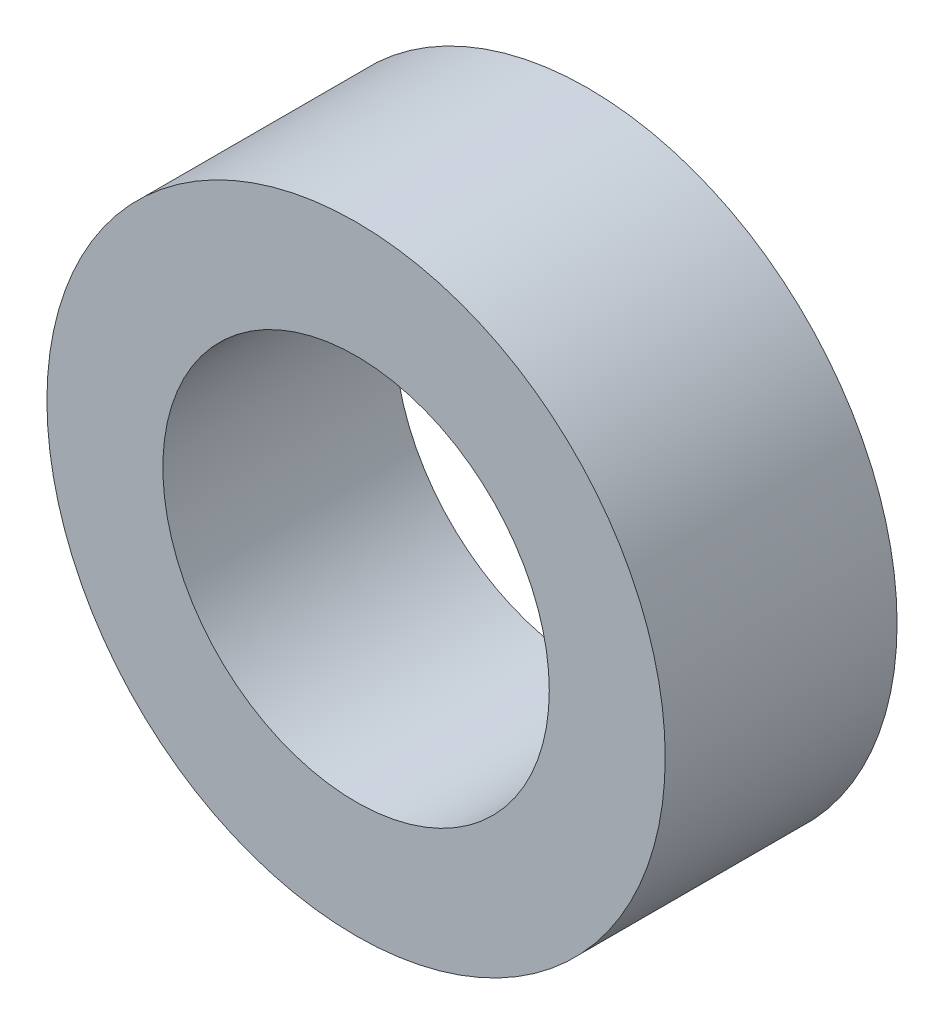
ISO-10303-21;
HEADER;
FILE_DESCRIPTION(('STEP AP214'),'2;1');
FILE_NAME('part.step','',(''),(''),'','','');
FILE_SCHEMA(('AUTOMOTIVE_DESIGN { 1 0 10303 214 1 1 1 1 }'));
ENDSEC;
DATA;
#1=APPLICATION_CONTEXT('core data for automotive mechanical design processes');
#2=APPLICATION_PROTOCOL_DEFINITION('international standard','automotive_design',2000,#1);
#3=PRODUCT_CONTEXT('',#1,'mechanical');
#4=PRODUCT('Part','Part','',(#3));
#5=PRODUCT_RELATED_PRODUCT_CATEGORY('part','',(#4));
#6=PRODUCT_DEFINITION_FORMATION('','',#4);
#7=PRODUCT_DEFINITION_CONTEXT('part definition',#1,'design');
#8=PRODUCT_DEFINITION('design','',#6,#7);
#9=PRODUCT_DEFINITION_SHAPE('','',#8);
#10=(LENGTH_UNIT() NAMED_UNIT(*) SI_UNIT(.MILLI.,.METRE.));
#11=(NAMED_UNIT(*) PLANE_ANGLE_UNIT() SI_UNIT($,.RADIAN.));
#12=(NAMED_UNIT(*) SI_UNIT($,.STERADIAN.) SOLID_ANGLE_UNIT());
#13=UNCERTAINTY_MEASURE_WITH_UNIT(LENGTH_MEASURE(1.E-05),#10,'distance_accuracy_value','');
#14=(GEOMETRIC_REPRESENTATION_CONTEXT(3) GLOBAL_UNCERTAINTY_ASSIGNED_CONTEXT((#13)) GLOBAL_UNIT_ASSIGNED_CONTEXT((#10,
#11,#12)) REPRESENTATION_CONTEXT('',''));
#15=CARTESIAN_POINT('',(0.,0.,0.));
#16=DIRECTION('',(0.,0.,1.));
#17=DIRECTION('',(1.,0.,0.));
#18=AXIS2_PLACEMENT_3D('',#15,#16,#17);
#19=CARTESIAN_POINT('',(0.,0.,6.));
#20=DIRECTION('',(0.,0.,1.));
#21=DIRECTION('',(1.,0.,0.));
#22=AXIS2_PLACEMENT_3D('',#19,#20,#21);
#23=PLANE('',#22);
#24=CARTESIAN_POINT('',(0.,0.,6.));
#25=DIRECTION('',(0.,0.,1.));
#26=DIRECTION('',(1.,0.,0.));
#27=AXIS2_PLACEMENT_3D('',#24,#25,#26);
#28=CIRCLE('',#27,8.);
#29=CARTESIAN_POINT('',(8.,0.,6.));
#30=VERTEX_POINT('',#29);
#31=EDGE_CURVE('E10',#30,#30,#28,.T.);
#32=ORIENTED_EDGE('',*,*,#31,.T.);
#33=EDGE_LOOP('',(#32));
#34=FACE_BOUND('',#33,.T.);
#35=CARTESIAN_POINT('',(0.,0.,6.));
#36=DIRECTION('',(0.,0.,1.));
#37=DIRECTION('',(1.,0.,0.));
#38=AXIS2_PLACEMENT_3D('',#35,#36,#37);
#39=CIRCLE('',#38,5.);
#40=CARTESIAN_POINT('',(5.,0.,6.));
#41=VERTEX_POINT('',#40);
#42=EDGE_CURVE('E43',#41,#41,#39,.T.);
#43=ORIENTED_EDGE('',*,*,#42,.F.);
#44=EDGE_LOOP('',(#43));
#45=FACE_BOUND('',#44,.T.);
#46=ADVANCED_FACE('F32',(#34,#45),#23,.T.);
#47=CARTESIAN_POINT('',(0.,0.,0.));
#48=DIRECTION('',(0.,0.,1.));
#49=DIRECTION('',(1.,0.,0.));
#50=AXIS2_PLACEMENT_3D('',#47,#48,#49);
#51=PLANE('',#50);
#52=CARTESIAN_POINT('',(0.,0.,0.));
#53=DIRECTION('',(0.,0.,1.));
#54=DIRECTION('',(1.,0.,0.));
#55=AXIS2_PLACEMENT_3D('',#52,#53,#54);
#56=CIRCLE('',#55,8.);
#57=CARTESIAN_POINT('',(8.,0.,0.));
#58=VERTEX_POINT('',#57);
#59=EDGE_CURVE('E36',#58,#58,#56,.T.);
#60=ORIENTED_EDGE('',*,*,#59,.F.);
#61=EDGE_LOOP('',(#60));
#62=FACE_BOUND('',#61,.T.);
#63=CARTESIAN_POINT('',(0.,0.,0.));
#64=DIRECTION('',(0.,0.,1.));
#65=DIRECTION('',(1.,0.,0.));
#66=AXIS2_PLACEMENT_3D('',#63,#64,#65);
#67=CIRCLE('',#66,5.);
#68=CARTESIAN_POINT('',(5.,0.,0.));
#69=VERTEX_POINT('',#68);
#70=EDGE_CURVE('E45',#69,#69,#67,.T.);
#71=ORIENTED_EDGE('',*,*,#70,.T.);
#72=EDGE_LOOP('',(#71));
#73=FACE_BOUND('',#72,.T.);
#74=ADVANCED_FACE('F55',(#62,#73),#51,.F.);
#75=CARTESIAN_POINT('',(0.,0.,6.));
#76=DIRECTION('',(0.,0.,-1.));
#77=DIRECTION('',(-1.,0.,0.));
#78=AXIS2_PLACEMENT_3D('',#75,#76,#77);
#79=CYLINDRICAL_SURFACE('',#78,8.);
#80=ORIENTED_EDGE('',*,*,#31,.F.);
#81=EDGE_LOOP('',(#80));
#82=FACE_BOUND('',#81,.T.);
#83=ORIENTED_EDGE('',*,*,#59,.T.);
#84=EDGE_LOOP('',(#83));
#85=FACE_BOUND('',#84,.T.);
#86=ADVANCED_FACE('F34',(#82,#85),#79,.T.);
#87=CARTESIAN_POINT('',(0.,0.,6.));
#88=DIRECTION('',(0.,0.,-1.));
#89=DIRECTION('',(-1.,0.,0.));
#90=AXIS2_PLACEMENT_3D('',#87,#88,#89);
#91=CYLINDRICAL_SURFACE('',#90,5.);
#92=ORIENTED_EDGE('',*,*,#42,.T.);
#93=EDGE_LOOP('',(#92));
#94=FACE_BOUND('',#93,.T.);
#95=ORIENTED_EDGE('',*,*,#70,.F.);
#96=EDGE_LOOP('',(#95));
#97=FACE_BOUND('',#96,.T.);
#98=ADVANCED_FACE('F51',(#94,#97),#91,.F.);
#99=CLOSED_SHELL('',(#46,#74,#86,#98));
#100=MANIFOLD_SOLID_BREP('B2',#99);
#101=ADVANCED_BREP_SHAPE_REPRESENTATION('',(#18,#100),#14);
#102=SHAPE_DEFINITION_REPRESENTATION(#9,#101);
ENDSEC;
END-ISO-10303-21;
